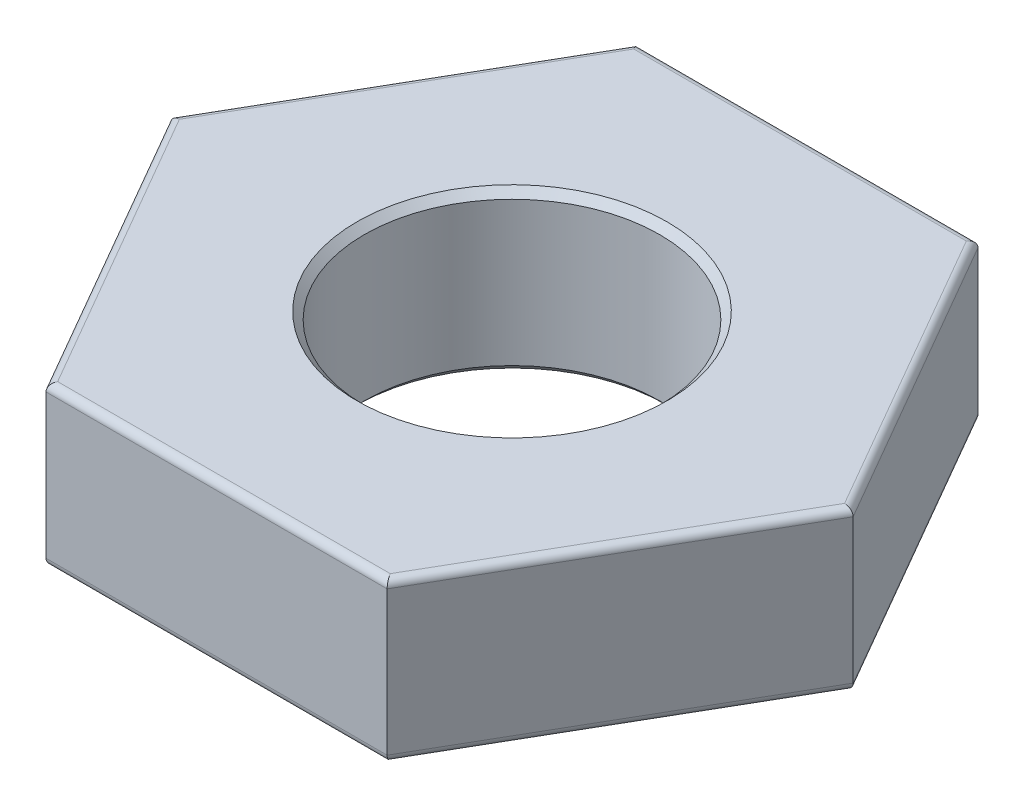
ISO-10303-21;
HEADER;
FILE_DESCRIPTION(('STEP AP214'),'2;1');
FILE_NAME('part.step','',(''),(''),'','','');
FILE_SCHEMA(('AUTOMOTIVE_DESIGN { 1 0 10303 214 1 1 1 1 }'));
ENDSEC;
DATA;
#1=APPLICATION_CONTEXT('core data for automotive mechanical design processes');
#2=APPLICATION_PROTOCOL_DEFINITION('international standard','automotive_design',2000,#1);
#3=PRODUCT_CONTEXT('',#1,'mechanical');
#4=PRODUCT('Part','Part','',(#3));
#5=PRODUCT_RELATED_PRODUCT_CATEGORY('part','',(#4));
#6=PRODUCT_DEFINITION_FORMATION('','',#4);
#7=PRODUCT_DEFINITION_CONTEXT('part definition',#1,'design');
#8=PRODUCT_DEFINITION('design','',#6,#7);
#9=PRODUCT_DEFINITION_SHAPE('','',#8);
#10=(LENGTH_UNIT() NAMED_UNIT(*) SI_UNIT(.MILLI.,.METRE.));
#11=(NAMED_UNIT(*) PLANE_ANGLE_UNIT() SI_UNIT($,.RADIAN.));
#12=(NAMED_UNIT(*) SI_UNIT($,.STERADIAN.) SOLID_ANGLE_UNIT());
#13=UNCERTAINTY_MEASURE_WITH_UNIT(LENGTH_MEASURE(1.E-05),#10,'distance_accuracy_value','');
#14=(GEOMETRIC_REPRESENTATION_CONTEXT(3) GLOBAL_UNCERTAINTY_ASSIGNED_CONTEXT((#13)) GLOBAL_UNIT_ASSIGNED_CONTEXT((#10,
#11,#12)) REPRESENTATION_CONTEXT('',''));
#15=CARTESIAN_POINT('',(0.,0.,0.));
#16=DIRECTION('',(0.,0.,1.));
#17=DIRECTION('',(1.,0.,0.));
#18=AXIS2_PLACEMENT_3D('',#15,#16,#17);
#19=CARTESIAN_POINT('',(0.,2.15,0.));
#20=DIRECTION('',(0.,-1.,0.));
#21=DIRECTION('',(0.,0.,-1.));
#22=AXIS2_PLACEMENT_3D('',#19,#20,#21);
#23=PLANE('',#22);
#24=CARTESIAN_POINT('',(0.,2.15,0.));
#25=DIRECTION('',(0.,-1.,0.));
#26=DIRECTION('',(0.,0.,-1.));
#27=AXIS2_PLACEMENT_3D('',#24,#25,#26);
#28=CIRCLE('',#27,2.10000000000001);
#29=CARTESIAN_POINT('',(0.,2.15,-2.10000000000001));
#30=VERTEX_POINT('',#29);
#31=EDGE_CURVE('E72',#30,#30,#28,.T.);
#32=ORIENTED_EDGE('',*,*,#31,.T.);
#33=EDGE_LOOP('',(#32));
#34=FACE_BOUND('',#33,.T.);
#35=DIRECTION('',(-1.,0.,0.));
#36=VECTOR('',#35,1.);
#37=CARTESIAN_POINT('',(2.3094010767585,2.15,3.9));
#38=LINE('',#37,#36);
#39=CARTESIAN_POINT('',(-2.25166604983954,2.15,3.9));
#40=VERTEX_POINT('',#39);
#41=CARTESIAN_POINT('',(2.25166604983954,2.15,3.9));
#42=VERTEX_POINT('',#41);
#43=EDGE_CURVE('E241',#40,#42,#38,.F.);
#44=ORIENTED_EDGE('',*,*,#43,.T.);
#45=DIRECTION('',(-0.5,0.,0.866025403784439));
#46=VECTOR('',#45,1.);
#47=CARTESIAN_POINT('',(4.53219961313856,2.15,-0.0499999999999984));
#48=LINE('',#47,#46);
#49=CARTESIAN_POINT('',(4.50333209967908,2.15,0.));
#50=VERTEX_POINT('',#49);
#51=EDGE_CURVE('E255',#42,#50,#48,.F.);
#52=ORIENTED_EDGE('',*,*,#51,.T.);
#53=DIRECTION('',(0.499999999999999,0.,0.866025403784439));
#54=VECTOR('',#53,1.);
#55=CARTESIAN_POINT('',(2.22279853638006,2.15,-3.95));
#56=LINE('',#55,#54);
#57=CARTESIAN_POINT('',(2.25166604983954,2.15,-3.9));
#58=VERTEX_POINT('',#57);
#59=EDGE_CURVE('E86',#50,#58,#56,.F.);
#60=ORIENTED_EDGE('',*,*,#59,.T.);
#61=DIRECTION('',(1.,0.,0.));
#62=VECTOR('',#61,1.);
#63=CARTESIAN_POINT('',(-2.3094010767585,2.15,-3.9));
#64=LINE('',#63,#62);
#65=CARTESIAN_POINT('',(-2.25166604983954,2.15,-3.9));
#66=VERTEX_POINT('',#65);
#67=EDGE_CURVE('E250',#58,#66,#64,.F.);
#68=ORIENTED_EDGE('',*,*,#67,.T.);
#69=DIRECTION('',(0.5,0.,-0.866025403784439));
#70=VECTOR('',#69,1.);
#71=CARTESIAN_POINT('',(-4.53219961313856,2.15,0.0499999999999999));
#72=LINE('',#71,#70);
#73=CARTESIAN_POINT('',(-4.50333209967908,2.15,0.));
#74=VERTEX_POINT('',#73);
#75=EDGE_CURVE('E247',#66,#74,#72,.F.);
#76=ORIENTED_EDGE('',*,*,#75,.T.);
#77=DIRECTION('',(-0.5,0.,-0.866025403784439));
#78=VECTOR('',#77,1.);
#79=CARTESIAN_POINT('',(-2.22279853638006,2.15,3.95));
#80=LINE('',#79,#78);
#81=EDGE_CURVE('E244',#74,#40,#80,.F.);
#82=ORIENTED_EDGE('',*,*,#81,.T.);
#83=EDGE_LOOP('',(#44,#52,#60,#68,#76,#82));
#84=FACE_BOUND('',#83,.T.);
#85=ADVANCED_FACE('F62',(#34,#84),#23,.F.);
#86=CARTESIAN_POINT('',(0.,0.,0.));
#87=DIRECTION('',(0.,-1.,0.));
#88=DIRECTION('',(0.,0.,-1.));
#89=AXIS2_PLACEMENT_3D('',#86,#87,#88);
#90=PLANE('',#89);
#91=CARTESIAN_POINT('',(0.,0.,0.));
#92=DIRECTION('',(0.,-1.,0.));
#93=DIRECTION('',(0.,0.,-1.));
#94=AXIS2_PLACEMENT_3D('',#91,#92,#93);
#95=CIRCLE('',#94,2.09999999999999);
#96=CARTESIAN_POINT('',(0.,0.,-2.09999999999999));
#97=VERTEX_POINT('',#96);
#98=EDGE_CURVE('E12',#97,#97,#95,.F.);
#99=ORIENTED_EDGE('',*,*,#98,.T.);
#100=EDGE_LOOP('',(#99));
#101=FACE_BOUND('',#100,.T.);
#102=DIRECTION('',(-0.5,0.,0.866025403784439));
#103=VECTOR('',#102,1.);
#104=CARTESIAN_POINT('',(3.37749907475931,0.,1.95));
#105=LINE('',#104,#103);
#106=CARTESIAN_POINT('',(4.50333209967908,0.,0.));
#107=VERTEX_POINT('',#106);
#108=CARTESIAN_POINT('',(2.25166604983954,0.,3.9));
#109=VERTEX_POINT('',#108);
#110=EDGE_CURVE('E159',#107,#109,#105,.T.);
#111=ORIENTED_EDGE('',*,*,#110,.T.);
#112=DIRECTION('',(-1.,0.,0.));
#113=VECTOR('',#112,1.);
#114=CARTESIAN_POINT('',(0.,0.,3.9));
#115=LINE('',#114,#113);
#116=CARTESIAN_POINT('',(-2.25166604983954,0.,3.9));
#117=VERTEX_POINT('',#116);
#118=EDGE_CURVE('E201',#109,#117,#115,.T.);
#119=ORIENTED_EDGE('',*,*,#118,.T.);
#120=DIRECTION('',(-0.5,0.,-0.866025403784439));
#121=VECTOR('',#120,1.);
#122=CARTESIAN_POINT('',(-3.37749907475931,0.,1.95));
#123=LINE('',#122,#121);
#124=CARTESIAN_POINT('',(-4.50333209967908,0.,0.));
#125=VERTEX_POINT('',#124);
#126=EDGE_CURVE('E198',#117,#125,#123,.T.);
#127=ORIENTED_EDGE('',*,*,#126,.T.);
#128=DIRECTION('',(0.5,0.,-0.866025403784439));
#129=VECTOR('',#128,1.);
#130=CARTESIAN_POINT('',(-3.37749907475931,0.,-1.95));
#131=LINE('',#130,#129);
#132=CARTESIAN_POINT('',(-2.25166604983954,0.,-3.9));
#133=VERTEX_POINT('',#132);
#134=EDGE_CURVE('E195',#125,#133,#131,.T.);
#135=ORIENTED_EDGE('',*,*,#134,.T.);
#136=DIRECTION('',(1.,0.,0.));
#137=VECTOR('',#136,1.);
#138=CARTESIAN_POINT('',(0.,0.,-3.9));
#139=LINE('',#138,#137);
#140=CARTESIAN_POINT('',(2.25166604983954,0.,-3.9));
#141=VERTEX_POINT('',#140);
#142=EDGE_CURVE('E162',#133,#141,#139,.T.);
#143=ORIENTED_EDGE('',*,*,#142,.T.);
#144=DIRECTION('',(0.499999999999999,0.,0.866025403784439));
#145=VECTOR('',#144,1.);
#146=CARTESIAN_POINT('',(3.37749907475931,0.,-1.95));
#147=LINE('',#146,#145);
#148=EDGE_CURVE('E154',#141,#107,#147,.T.);
#149=ORIENTED_EDGE('',*,*,#148,.T.);
#150=EDGE_LOOP('',(#111,#119,#127,#135,#143,#149));
#151=FACE_BOUND('',#150,.T.);
#152=ADVANCED_FACE('F156',(#101,#151),#90,.T.);
#153=CARTESIAN_POINT('',(-4.61880215351701,2.15,0.));
#154=DIRECTION('',(-0.866025403784438,0.,-0.5));
#155=DIRECTION('',(-0.5,0.,0.866025403784439));
#156=AXIS2_PLACEMENT_3D('',#153,#154,#155);
#157=PLANE('',#156);
#158=DIRECTION('',(0.,-1.,0.));
#159=VECTOR('',#158,1.);
#160=CARTESIAN_POINT('',(-2.3094010767585,2.15,-4.));
#161=LINE('',#160,#159);
#162=CARTESIAN_POINT('',(-2.3094010767585,2.05,-4.));
#163=VERTEX_POINT('',#162);
#164=CARTESIAN_POINT('',(-2.3094010767585,0.100000000000001,-4.));
#165=VERTEX_POINT('',#164);
#166=EDGE_CURVE('E190',#163,#165,#161,.T.);
#167=ORIENTED_EDGE('',*,*,#166,.T.);
#168=DIRECTION('',(0.5,0.,-0.866025403784439));
#169=VECTOR('',#168,1.);
#170=CARTESIAN_POINT('',(-4.61880215351701,0.0999999999999998,0.));
#171=LINE('',#170,#169);
#172=CARTESIAN_POINT('',(-4.61880215351701,0.100000000000001,0.));
#173=VERTEX_POINT('',#172);
#174=EDGE_CURVE('E220',#165,#173,#171,.F.);
#175=ORIENTED_EDGE('',*,*,#174,.T.);
#176=DIRECTION('',(0.,-1.,0.));
#177=VECTOR('',#176,1.);
#178=CARTESIAN_POINT('',(-4.61880215351701,2.15,0.));
#179=LINE('',#178,#177);
#180=CARTESIAN_POINT('',(-4.61880215351701,2.05,0.));
#181=VERTEX_POINT('',#180);
#182=EDGE_CURVE('E183',#181,#173,#179,.T.);
#183=ORIENTED_EDGE('',*,*,#182,.F.);
#184=DIRECTION('',(0.5,0.,-0.866025403784439));
#185=VECTOR('',#184,1.);
#186=CARTESIAN_POINT('',(-2.3094010767585,2.05,-4.));
#187=LINE('',#186,#185);
#188=EDGE_CURVE('E217',#181,#163,#187,.T.);
#189=ORIENTED_EDGE('',*,*,#188,.T.);
#190=EDGE_LOOP('',(#167,#175,#183,#189));
#191=FACE_BOUND('',#190,.T.);
#192=ADVANCED_FACE('F324',(#191),#157,.T.);
#193=CARTESIAN_POINT('',(-2.3094010767585,2.15,4.));
#194=DIRECTION('',(-0.866025403784438,0.,0.5));
#195=DIRECTION('',(0.5,0.,0.866025403784439));
#196=AXIS2_PLACEMENT_3D('',#193,#194,#195);
#197=PLANE('',#196);
#198=ORIENTED_EDGE('',*,*,#182,.T.);
#199=DIRECTION('',(-0.5,0.,-0.866025403784439));
#200=VECTOR('',#199,1.);
#201=CARTESIAN_POINT('',(-2.3094010767585,0.0999999999999998,4.));
#202=LINE('',#201,#200);
#203=CARTESIAN_POINT('',(-2.3094010767585,0.100000000000001,4.));
#204=VERTEX_POINT('',#203);
#205=EDGE_CURVE('E214',#173,#204,#202,.F.);
#206=ORIENTED_EDGE('',*,*,#205,.T.);
#207=DIRECTION('',(0.,-1.,0.));
#208=VECTOR('',#207,1.);
#209=CARTESIAN_POINT('',(-2.3094010767585,2.15,4.));
#210=LINE('',#209,#208);
#211=CARTESIAN_POINT('',(-2.3094010767585,2.05,4.));
#212=VERTEX_POINT('',#211);
#213=EDGE_CURVE('E187',#212,#204,#210,.T.);
#214=ORIENTED_EDGE('',*,*,#213,.F.);
#215=DIRECTION('',(-0.5,0.,-0.866025403784439));
#216=VECTOR('',#215,1.);
#217=CARTESIAN_POINT('',(-4.61880215351701,2.05,0.));
#218=LINE('',#217,#216);
#219=EDGE_CURVE('E211',#212,#181,#218,.T.);
#220=ORIENTED_EDGE('',*,*,#219,.T.);
#221=EDGE_LOOP('',(#198,#206,#214,#220));
#222=FACE_BOUND('',#221,.T.);
#223=ADVANCED_FACE('F330',(#222),#197,.T.);
#224=CARTESIAN_POINT('',(2.3094010767585,2.15,4.));
#225=DIRECTION('',(0.,0.,1.));
#226=DIRECTION('',(1.,0.,0.));
#227=AXIS2_PLACEMENT_3D('',#224,#225,#226);
#228=PLANE('',#227);
#229=ORIENTED_EDGE('',*,*,#213,.T.);
#230=DIRECTION('',(-1.,0.,0.));
#231=VECTOR('',#230,1.);
#232=CARTESIAN_POINT('',(2.3094010767585,0.0999999999999998,4.));
#233=LINE('',#232,#231);
#234=CARTESIAN_POINT('',(2.3094010767585,0.100000000000001,4.));
#235=VERTEX_POINT('',#234);
#236=EDGE_CURVE('E207',#204,#235,#233,.F.);
#237=ORIENTED_EDGE('',*,*,#236,.T.);
#238=DIRECTION('',(0.,-1.,0.));
#239=VECTOR('',#238,1.);
#240=CARTESIAN_POINT('',(2.3094010767585,2.15,4.));
#241=LINE('',#240,#239);
#242=CARTESIAN_POINT('',(2.3094010767585,2.05,4.));
#243=VERTEX_POINT('',#242);
#244=EDGE_CURVE('E420',#243,#235,#241,.T.);
#245=ORIENTED_EDGE('',*,*,#244,.F.);
#246=DIRECTION('',(-1.,0.,0.));
#247=VECTOR('',#246,1.);
#248=CARTESIAN_POINT('',(-2.3094010767585,2.05,4.));
#249=LINE('',#248,#247);
#250=EDGE_CURVE('E204',#243,#212,#249,.T.);
#251=ORIENTED_EDGE('',*,*,#250,.T.);
#252=EDGE_LOOP('',(#229,#237,#245,#251));
#253=FACE_BOUND('',#252,.T.);
#254=ADVANCED_FACE('F337',(#253),#228,.T.);
#255=CARTESIAN_POINT('',(4.61880215351701,2.15,0.));
#256=DIRECTION('',(0.866025403784439,0.,0.5));
#257=DIRECTION('',(0.5,0.,-0.866025403784439));
#258=AXIS2_PLACEMENT_3D('',#255,#256,#257);
#259=PLANE('',#258);
#260=ORIENTED_EDGE('',*,*,#244,.T.);
#261=DIRECTION('',(-0.5,0.,0.866025403784439));
#262=VECTOR('',#261,1.);
#263=CARTESIAN_POINT('',(4.61880215351701,0.0999999999999998,0.));
#264=LINE('',#263,#262);
#265=CARTESIAN_POINT('',(4.61880215351701,0.100000000000001,0.));
#266=VERTEX_POINT('',#265);
#267=EDGE_CURVE('E238',#235,#266,#264,.F.);
#268=ORIENTED_EDGE('',*,*,#267,.T.);
#269=DIRECTION('',(0.,-1.,0.));
#270=VECTOR('',#269,1.);
#271=CARTESIAN_POINT('',(4.61880215351701,2.15,0.));
#272=LINE('',#271,#270);
#273=CARTESIAN_POINT('',(4.61880215351701,2.05,0.));
#274=VERTEX_POINT('',#273);
#275=EDGE_CURVE('E414',#274,#266,#272,.T.);
#276=ORIENTED_EDGE('',*,*,#275,.F.);
#277=DIRECTION('',(-0.5,0.,0.866025403784439));
#278=VECTOR('',#277,1.);
#279=CARTESIAN_POINT('',(2.3094010767585,2.05,4.));
#280=LINE('',#279,#278);
#281=EDGE_CURVE('E234',#274,#243,#280,.T.);
#282=ORIENTED_EDGE('',*,*,#281,.T.);
#283=EDGE_LOOP('',(#260,#268,#276,#282));
#284=FACE_BOUND('',#283,.T.);
#285=ADVANCED_FACE('F341',(#284),#259,.T.);
#286=CARTESIAN_POINT('',(2.3094010767585,2.15,-4.));
#287=DIRECTION('',(0.866025403784439,0.,-0.499999999999999));
#288=DIRECTION('',(-0.499999999999999,0.,-0.866025403784439));
#289=AXIS2_PLACEMENT_3D('',#286,#287,#288);
#290=PLANE('',#289);
#291=ORIENTED_EDGE('',*,*,#275,.T.);
#292=DIRECTION('',(0.499999999999999,0.,0.866025403784439));
#293=VECTOR('',#292,1.);
#294=CARTESIAN_POINT('',(2.3094010767585,0.0999999999999998,-4.));
#295=LINE('',#294,#293);
#296=CARTESIAN_POINT('',(2.3094010767585,0.100000000000001,-4.));
#297=VERTEX_POINT('',#296);
#298=EDGE_CURVE('E172',#266,#297,#295,.F.);
#299=ORIENTED_EDGE('',*,*,#298,.T.);
#300=DIRECTION('',(0.,-1.,0.));
#301=VECTOR('',#300,1.);
#302=CARTESIAN_POINT('',(2.3094010767585,2.15,-4.));
#303=LINE('',#302,#301);
#304=CARTESIAN_POINT('',(2.3094010767585,2.05,-4.));
#305=VERTEX_POINT('',#304);
#306=EDGE_CURVE('E416',#305,#297,#303,.T.);
#307=ORIENTED_EDGE('',*,*,#306,.F.);
#308=DIRECTION('',(0.499999999999999,0.,0.866025403784439));
#309=VECTOR('',#308,1.);
#310=CARTESIAN_POINT('',(4.61880215351701,2.05,0.));
#311=LINE('',#310,#309);
#312=EDGE_CURVE('E229',#305,#274,#311,.T.);
#313=ORIENTED_EDGE('',*,*,#312,.T.);
#314=EDGE_LOOP('',(#291,#299,#307,#313));
#315=FACE_BOUND('',#314,.T.);
#316=ADVANCED_FACE('F345',(#315),#290,.T.);
#317=CARTESIAN_POINT('',(-2.3094010767585,2.15,-4.));
#318=DIRECTION('',(0.,0.,-1.));
#319=DIRECTION('',(-1.,0.,0.));
#320=AXIS2_PLACEMENT_3D('',#317,#318,#319);
#321=PLANE('',#320);
#322=ORIENTED_EDGE('',*,*,#306,.T.);
#323=DIRECTION('',(1.,0.,0.));
#324=VECTOR('',#323,1.);
#325=CARTESIAN_POINT('',(-2.3094010767585,0.0999999999999998,-4.));
#326=LINE('',#325,#324);
#327=EDGE_CURVE('E226',#297,#165,#326,.F.);
#328=ORIENTED_EDGE('',*,*,#327,.T.);
#329=ORIENTED_EDGE('',*,*,#166,.F.);
#330=DIRECTION('',(1.,0.,0.));
#331=VECTOR('',#330,1.);
#332=CARTESIAN_POINT('',(2.3094010767585,2.05,-4.));
#333=LINE('',#332,#331);
#334=EDGE_CURVE('E223',#163,#305,#333,.T.);
#335=ORIENTED_EDGE('',*,*,#334,.T.);
#336=EDGE_LOOP('',(#322,#328,#329,#335));
#337=FACE_BOUND('',#336,.T.);
#338=ADVANCED_FACE('F315',(#337),#321,.T.);
#339=CARTESIAN_POINT('',(0.,2.15,0.));
#340=DIRECTION('',(0.,-1.,0.));
#341=DIRECTION('',(0.,0.,-1.));
#342=AXIS2_PLACEMENT_3D('',#339,#340,#341);
#343=CYLINDRICAL_SURFACE('',#342,2.);
#344=CARTESIAN_POINT('',(0.,2.05,0.));
#345=DIRECTION('',(0.,-1.,0.));
#346=DIRECTION('',(0.,0.,-1.));
#347=AXIS2_PLACEMENT_3D('',#344,#345,#346);
#348=CIRCLE('',#347,2.);
#349=CARTESIAN_POINT('',(0.,2.05,-2.));
#350=VERTEX_POINT('',#349);
#351=EDGE_CURVE('E297',#350,#350,#348,.F.);
#352=CARTESIAN_POINT('',(0.,0.0999999999999938,0.));
#353=DIRECTION('',(0.,-1.,0.));
#354=DIRECTION('',(0.,0.,-1.));
#355=AXIS2_PLACEMENT_3D('',#352,#353,#354);
#356=CIRCLE('',#355,2.);
#357=CARTESIAN_POINT('',(0.,0.0999999999999938,-2.));
#358=VERTEX_POINT('',#357);
#359=EDGE_CURVE('E258',#358,#358,#356,.T.);
#360=CARTESIAN_POINT('',(0.,2.05,-2.));
#361=CARTESIAN_POINT('',(0.,2.0296875,-2.));
#362=CARTESIAN_POINT('',(0.,2.009375,-2.));
#363=CARTESIAN_POINT('',(0.,1.96875,-2.));
#364=CARTESIAN_POINT('',(0.,1.9484375,-2.));
#365=CARTESIAN_POINT('',(0.,1.9078125,-2.));
#366=CARTESIAN_POINT('',(0.,1.8875,-2.));
#367=CARTESIAN_POINT('',(0.,1.846875,-2.));
#368=CARTESIAN_POINT('',(0.,1.8265625,-2.));
#369=CARTESIAN_POINT('',(0.,1.7859375,-2.));
#370=CARTESIAN_POINT('',(0.,1.765625,-2.));
#371=CARTESIAN_POINT('',(0.,1.725,-2.));
#372=CARTESIAN_POINT('',(0.,1.7046875,-2.));
#373=CARTESIAN_POINT('',(0.,1.6640625,-2.));
#374=CARTESIAN_POINT('',(0.,1.64375,-2.));
#375=CARTESIAN_POINT('',(0.,1.603125,-2.));
#376=CARTESIAN_POINT('',(0.,1.5828125,-2.));
#377=CARTESIAN_POINT('',(0.,1.5421875,-2.));
#378=CARTESIAN_POINT('',(0.,1.521875,-2.));
#379=CARTESIAN_POINT('',(0.,1.48124999999999,-2.));
#380=CARTESIAN_POINT('',(0.,1.4609375,-2.));
#381=CARTESIAN_POINT('',(0.,1.42031249999999,-2.));
#382=CARTESIAN_POINT('',(0.,1.4,-2.));
#383=CARTESIAN_POINT('',(0.,1.35937499999999,-2.));
#384=CARTESIAN_POINT('',(0.,1.33906249999999,-2.));
#385=CARTESIAN_POINT('',(0.,1.29843749999999,-2.));
#386=CARTESIAN_POINT('',(0.,1.27812499999999,-2.));
#387=CARTESIAN_POINT('',(0.,1.23749999999999,-2.));
#388=CARTESIAN_POINT('',(0.,1.21718749999999,-2.));
#389=CARTESIAN_POINT('',(0.,1.17656249999999,-2.));
#390=CARTESIAN_POINT('',(0.,1.15624999999999,-2.));
#391=CARTESIAN_POINT('',(0.,1.11562499999999,-2.));
#392=CARTESIAN_POINT('',(0.,1.09531249999999,-2.));
#393=CARTESIAN_POINT('',(0.,1.05468749999999,-2.));
#394=CARTESIAN_POINT('',(0.,1.03437499999999,-2.));
#395=CARTESIAN_POINT('',(0.,0.993749999999995,-2.));
#396=CARTESIAN_POINT('',(0.,0.973437499999995,-2.));
#397=CARTESIAN_POINT('',(0.,0.932812499999994,-2.));
#398=CARTESIAN_POINT('',(0.,0.912499999999995,-2.));
#399=CARTESIAN_POINT('',(0.,0.871874999999995,-2.));
#400=CARTESIAN_POINT('',(0.,0.851562499999994,-2.));
#401=CARTESIAN_POINT('',(0.,0.810937499999994,-2.));
#402=CARTESIAN_POINT('',(0.,0.790624999999994,-2.));
#403=CARTESIAN_POINT('',(0.,0.749999999999994,-2.));
#404=CARTESIAN_POINT('',(0.,0.729687499999994,-2.));
#405=CARTESIAN_POINT('',(0.,0.689062499999994,-2.));
#406=CARTESIAN_POINT('',(0.,0.668749999999994,-2.));
#407=CARTESIAN_POINT('',(0.,0.628124999999994,-2.));
#408=CARTESIAN_POINT('',(0.,0.607812499999994,-2.));
#409=CARTESIAN_POINT('',(0.,0.567187499999994,-2.));
#410=CARTESIAN_POINT('',(0.,0.546874999999994,-2.));
#411=CARTESIAN_POINT('',(0.,0.506249999999994,-2.));
#412=CARTESIAN_POINT('',(0.,0.485937499999994,-2.));
#413=CARTESIAN_POINT('',(0.,0.445312499999994,-2.));
#414=CARTESIAN_POINT('',(0.,0.424999999999994,-2.));
#415=CARTESIAN_POINT('',(0.,0.384374999999994,-2.));
#416=CARTESIAN_POINT('',(0.,0.364062499999994,-2.));
#417=CARTESIAN_POINT('',(0.,0.323437499999994,-2.));
#418=CARTESIAN_POINT('',(0.,0.303124999999994,-2.));
#419=CARTESIAN_POINT('',(0.,0.262499999999994,-2.));
#420=CARTESIAN_POINT('',(0.,0.242187499999994,-2.));
#421=CARTESIAN_POINT('',(0.,0.201562499999994,-2.));
#422=CARTESIAN_POINT('',(0.,0.181249999999994,-2.));
#423=CARTESIAN_POINT('',(0.,0.140624999999994,-2.));
#424=CARTESIAN_POINT('',(0.,0.120312499999994,-2.));
#425=CARTESIAN_POINT('',(0.,0.0999999999999938,-2.));
#426=B_SPLINE_CURVE_WITH_KNOTS('',3,(#360,#361,#362,#363,#364,#365,#366,#367,#368,#369,#370,
#371,#372,#373,#374,#375,#376,#377,#378,#379,#380,#381,#382,#383,#384,#385,#386,#387,#388,#389,
#390,#391,#392,#393,#394,#395,#396,#397,#398,#399,#400,#401,#402,#403,#404,#405,#406,#407,#408,
#409,#410,#411,#412,#413,#414,#415,#416,#417,#418,#419,#420,#421,#422,#423,#424,#425),
.UNSPECIFIED.,.F.,.F.,(4,2,2,2,2,2,2,2,2,2,2,2,2,2,2,2,2,2,2,2,2,2,2,2,2,2,2,2,2,2,2,2,4),(0.,
0.0609375000000002,0.121875,0.1828125,0.24375,0.3046875,0.365625,0.426562500000001,
0.487500000000001,0.548437500000001,0.609375000000001,0.670312500000001,0.731250000000001,
0.792187500000001,0.853125000000001,0.914062500000001,0.975000000000001,1.0359375,1.096875,
1.1578125,1.21875,1.2796875,1.340625,1.4015625,1.4625,1.5234375,1.584375,1.6453125,1.70625,
1.7671875,1.828125,1.8890625,1.95),.UNSPECIFIED.);
#427=EDGE_CURVE('BSEAM311',#350,#358,#426,.T.);
#428=ORIENTED_EDGE('',*,*,#351,.T.);
#429=ORIENTED_EDGE('',*,*,#359,.T.);
#430=ORIENTED_EDGE('',*,*,#427,.T.);
#431=ORIENTED_EDGE('',*,*,#427,.F.);
#432=EDGE_LOOP('',(#428,#430,#429,#431));
#433=FACE_BOUND('',#432,.T.);
#434=ADVANCED_FACE('F311',(#433),#343,.F.);
#435=CARTESIAN_POINT('',(0.,0.1,-3.9));
#436=DIRECTION('',(1.,0.,0.));
#437=DIRECTION('',(0.,0.,-1.));
#438=AXIS2_PLACEMENT_3D('',#435,#436,#437);
#439=CYLINDRICAL_SURFACE('',#438,0.1);
#440=CARTESIAN_POINT('',(-2.25166604983954,0.1,-3.9));
#441=DIRECTION('',(0.866025403784439,0.,-0.5));
#442=DIRECTION('',(0.5,0.,0.866025403784439));
#443=AXIS2_PLACEMENT_3D('',#440,#441,#442);
#444=ELLIPSE('',#443,0.115470053837925,0.1);
#445=EDGE_CURVE('E176',#165,#133,#444,.F.);
#446=ORIENTED_EDGE('',*,*,#445,.F.);
#447=ORIENTED_EDGE('',*,*,#327,.F.);
#448=CARTESIAN_POINT('',(2.25166604983954,0.1,-3.9));
#449=DIRECTION('',(0.866025403784438,0.,0.5));
#450=DIRECTION('',(-0.5,0.,0.866025403784439));
#451=AXIS2_PLACEMENT_3D('',#448,#449,#450);
#452=ELLIPSE('',#451,0.115470053837925,0.1);
#453=EDGE_CURVE('E271',#141,#297,#452,.T.);
#454=ORIENTED_EDGE('',*,*,#453,.F.);
#455=ORIENTED_EDGE('',*,*,#142,.F.);
#456=EDGE_LOOP('',(#446,#447,#454,#455));
#457=FACE_BOUND('',#456,.T.);
#458=ADVANCED_FACE('F314',(#457),#439,.T.);
#459=CARTESIAN_POINT('',(3.37749907475931,0.1,-1.95));
#460=DIRECTION('',(0.499999999999999,0.,0.866025403784439));
#461=DIRECTION('',(0.866025403784439,0.,-0.499999999999999));
#462=AXIS2_PLACEMENT_3D('',#459,#460,#461);
#463=CYLINDRICAL_SURFACE('',#462,0.1);
#464=ORIENTED_EDGE('',*,*,#453,.T.);
#465=ORIENTED_EDGE('',*,*,#298,.F.);
#466=CARTESIAN_POINT('',(4.50333209967908,0.1,0.));
#467=DIRECTION('',(0.,0.,1.));
#468=DIRECTION('',(-1.,0.,0.));
#469=AXIS2_PLACEMENT_3D('',#466,#467,#468);
#470=ELLIPSE('',#469,0.115470053837925,0.1);
#471=EDGE_CURVE('E170',#107,#266,#470,.T.);
#472=ORIENTED_EDGE('',*,*,#471,.F.);
#473=ORIENTED_EDGE('',*,*,#148,.F.);
#474=EDGE_LOOP('',(#464,#465,#472,#473));
#475=FACE_BOUND('',#474,.T.);
#476=ADVANCED_FACE('F171',(#475),#463,.T.);
#477=CARTESIAN_POINT('',(-3.37749907475931,0.1,-1.95));
#478=DIRECTION('',(0.5,0.,-0.866025403784439));
#479=DIRECTION('',(-0.866025403784439,0.,-0.5));
#480=AXIS2_PLACEMENT_3D('',#477,#478,#479);
#481=CYLINDRICAL_SURFACE('',#480,0.1);
#482=ORIENTED_EDGE('',*,*,#445,.T.);
#483=ORIENTED_EDGE('',*,*,#134,.F.);
#484=CARTESIAN_POINT('',(-4.50333209967908,0.1,0.));
#485=DIRECTION('',(0.,0.,-1.));
#486=DIRECTION('',(1.,0.,0.));
#487=AXIS2_PLACEMENT_3D('',#484,#485,#486);
#488=ELLIPSE('',#487,0.115470053837925,0.1);
#489=EDGE_CURVE('E177',#173,#125,#488,.F.);
#490=ORIENTED_EDGE('',*,*,#489,.F.);
#491=ORIENTED_EDGE('',*,*,#174,.F.);
#492=EDGE_LOOP('',(#482,#483,#490,#491));
#493=FACE_BOUND('',#492,.T.);
#494=ADVANCED_FACE('F364',(#493),#481,.T.);
#495=CARTESIAN_POINT('',(3.37749907475931,0.1,1.95));
#496=DIRECTION('',(-0.5,0.,0.866025403784439));
#497=DIRECTION('',(0.866025403784439,0.,0.5));
#498=AXIS2_PLACEMENT_3D('',#495,#496,#497);
#499=CYLINDRICAL_SURFACE('',#498,0.1);
#500=ORIENTED_EDGE('',*,*,#471,.T.);
#501=ORIENTED_EDGE('',*,*,#267,.F.);
#502=CARTESIAN_POINT('',(2.25166604983954,0.1,3.9));
#503=DIRECTION('',(-0.866025403784439,0.,0.5));
#504=DIRECTION('',(0.5,0.,0.866025403784439));
#505=AXIS2_PLACEMENT_3D('',#502,#503,#504);
#506=ELLIPSE('',#505,0.115470053837925,0.1);
#507=EDGE_CURVE('E180',#109,#235,#506,.T.);
#508=ORIENTED_EDGE('',*,*,#507,.F.);
#509=ORIENTED_EDGE('',*,*,#110,.F.);
#510=EDGE_LOOP('',(#500,#501,#508,#509));
#511=FACE_BOUND('',#510,.T.);
#512=ADVANCED_FACE('F179',(#511),#499,.T.);
#513=CARTESIAN_POINT('',(-3.37749907475931,0.1,1.95));
#514=DIRECTION('',(-0.5,0.,-0.866025403784439));
#515=DIRECTION('',(-0.866025403784438,0.,0.5));
#516=AXIS2_PLACEMENT_3D('',#513,#514,#515);
#517=CYLINDRICAL_SURFACE('',#516,0.1);
#518=ORIENTED_EDGE('',*,*,#489,.T.);
#519=ORIENTED_EDGE('',*,*,#126,.F.);
#520=CARTESIAN_POINT('',(-2.25166604983954,0.1,3.9));
#521=DIRECTION('',(-0.866025403784439,0.,-0.5));
#522=DIRECTION('',(0.5,0.,-0.866025403784439));
#523=AXIS2_PLACEMENT_3D('',#520,#521,#522);
#524=ELLIPSE('',#523,0.115470053837925,0.1);
#525=EDGE_CURVE('E259',#204,#117,#524,.F.);
#526=ORIENTED_EDGE('',*,*,#525,.F.);
#527=ORIENTED_EDGE('',*,*,#205,.F.);
#528=EDGE_LOOP('',(#518,#519,#526,#527));
#529=FACE_BOUND('',#528,.T.);
#530=ADVANCED_FACE('F357',(#529),#517,.T.);
#531=CARTESIAN_POINT('',(0.,0.1,3.9));
#532=DIRECTION('',(-1.,0.,0.));
#533=DIRECTION('',(0.,0.,1.));
#534=AXIS2_PLACEMENT_3D('',#531,#532,#533);
#535=CYLINDRICAL_SURFACE('',#534,0.1);
#536=ORIENTED_EDGE('',*,*,#507,.T.);
#537=ORIENTED_EDGE('',*,*,#236,.F.);
#538=ORIENTED_EDGE('',*,*,#525,.T.);
#539=ORIENTED_EDGE('',*,*,#118,.F.);
#540=EDGE_LOOP('',(#536,#537,#538,#539));
#541=FACE_BOUND('',#540,.T.);
#542=ADVANCED_FACE('F353',(#541),#535,.T.);
#543=CARTESIAN_POINT('',(-4.53219961313856,2.05,0.0499999999999998));
#544=DIRECTION('',(-0.5,0.,0.866025403784439));
#545=DIRECTION('',(0.866025403784439,0.,0.5));
#546=AXIS2_PLACEMENT_3D('',#543,#544,#545);
#547=CYLINDRICAL_SURFACE('',#546,0.1);
#548=CARTESIAN_POINT('',(-4.50333209967908,2.05,0.));
#549=DIRECTION('',(0.,0.,1.));
#550=DIRECTION('',(1.,0.,0.));
#551=AXIS2_PLACEMENT_3D('',#548,#549,#550);
#552=ELLIPSE('',#551,0.115470053837925,0.1);
#553=EDGE_CURVE('E287',#74,#181,#552,.T.);
#554=ORIENTED_EDGE('',*,*,#553,.F.);
#555=ORIENTED_EDGE('',*,*,#75,.F.);
#556=CARTESIAN_POINT('',(-2.25166604983954,2.05,-3.9));
#557=DIRECTION('',(-0.866025403784439,0.,0.5));
#558=DIRECTION('',(0.5,0.,0.866025403784439));
#559=AXIS2_PLACEMENT_3D('',#556,#557,#558);
#560=ELLIPSE('',#559,0.115470053837925,0.1);
#561=EDGE_CURVE('E262',#163,#66,#560,.F.);
#562=ORIENTED_EDGE('',*,*,#561,.F.);
#563=ORIENTED_EDGE('',*,*,#188,.F.);
#564=EDGE_LOOP('',(#554,#555,#562,#563));
#565=FACE_BOUND('',#564,.T.);
#566=ADVANCED_FACE('F356',(#565),#547,.T.);
#567=CARTESIAN_POINT('',(-2.3094010767585,2.05,-3.9));
#568=DIRECTION('',(-1.,0.,0.));
#569=DIRECTION('',(0.,0.,1.));
#570=AXIS2_PLACEMENT_3D('',#567,#568,#569);
#571=CYLINDRICAL_SURFACE('',#570,0.1);
#572=ORIENTED_EDGE('',*,*,#561,.T.);
#573=ORIENTED_EDGE('',*,*,#67,.F.);
#574=CARTESIAN_POINT('',(2.25166604983954,2.05,-3.9));
#575=DIRECTION('',(-0.866025403784438,0.,-0.5));
#576=DIRECTION('',(-0.5,0.,0.866025403784439));
#577=AXIS2_PLACEMENT_3D('',#574,#575,#576);
#578=ELLIPSE('',#577,0.115470053837925,0.1);
#579=EDGE_CURVE('E283',#305,#58,#578,.F.);
#580=ORIENTED_EDGE('',*,*,#579,.F.);
#581=ORIENTED_EDGE('',*,*,#334,.F.);
#582=EDGE_LOOP('',(#572,#573,#580,#581));
#583=FACE_BOUND('',#582,.T.);
#584=ADVANCED_FACE('F386',(#583),#571,.T.);
#585=CARTESIAN_POINT('',(-2.22279853638006,2.05,3.95));
#586=DIRECTION('',(0.5,0.,0.866025403784439));
#587=DIRECTION('',(0.866025403784438,0.,-0.5));
#588=AXIS2_PLACEMENT_3D('',#585,#586,#587);
#589=CYLINDRICAL_SURFACE('',#588,0.1);
#590=ORIENTED_EDGE('',*,*,#553,.T.);
#591=ORIENTED_EDGE('',*,*,#219,.F.);
#592=CARTESIAN_POINT('',(-2.25166604983954,2.05,3.9));
#593=DIRECTION('',(0.866025403784439,0.,0.5));
#594=DIRECTION('',(0.5,0.,-0.866025403784439));
#595=AXIS2_PLACEMENT_3D('',#592,#593,#594);
#596=ELLIPSE('',#595,0.115470053837925,0.1);
#597=EDGE_CURVE('E279',#40,#212,#596,.T.);
#598=ORIENTED_EDGE('',*,*,#597,.F.);
#599=ORIENTED_EDGE('',*,*,#81,.F.);
#600=EDGE_LOOP('',(#590,#591,#598,#599));
#601=FACE_BOUND('',#600,.T.);
#602=ADVANCED_FACE('F382',(#601),#589,.T.);
#603=CARTESIAN_POINT('',(2.22279853638006,2.05,-3.95));
#604=DIRECTION('',(-0.499999999999999,0.,-0.866025403784439));
#605=DIRECTION('',(-0.866025403784439,0.,0.499999999999999));
#606=AXIS2_PLACEMENT_3D('',#603,#604,#605);
#607=CYLINDRICAL_SURFACE('',#606,0.1);
#608=ORIENTED_EDGE('',*,*,#579,.T.);
#609=ORIENTED_EDGE('',*,*,#59,.F.);
#610=CARTESIAN_POINT('',(4.50333209967908,2.05,0.));
#611=DIRECTION('',(0.,0.,-1.));
#612=DIRECTION('',(-1.,0.,0.));
#613=AXIS2_PLACEMENT_3D('',#610,#611,#612);
#614=ELLIPSE('',#613,0.115470053837925,0.1);
#615=EDGE_CURVE('E79',#274,#50,#614,.F.);
#616=ORIENTED_EDGE('',*,*,#615,.F.);
#617=ORIENTED_EDGE('',*,*,#312,.F.);
#618=EDGE_LOOP('',(#608,#609,#616,#617));
#619=FACE_BOUND('',#618,.T.);
#620=ADVANCED_FACE('F378',(#619),#607,.T.);
#621=CARTESIAN_POINT('',(2.3094010767585,2.05,3.9));
#622=DIRECTION('',(1.,0.,0.));
#623=DIRECTION('',(0.,0.,-1.));
#624=AXIS2_PLACEMENT_3D('',#621,#622,#623);
#625=CYLINDRICAL_SURFACE('',#624,0.1);
#626=ORIENTED_EDGE('',*,*,#597,.T.);
#627=ORIENTED_EDGE('',*,*,#250,.F.);
#628=CARTESIAN_POINT('',(2.25166604983954,2.05,3.9));
#629=DIRECTION('',(0.866025403784439,0.,-0.5));
#630=DIRECTION('',(0.5,0.,0.866025403784439));
#631=AXIS2_PLACEMENT_3D('',#628,#629,#630);
#632=ELLIPSE('',#631,0.115470053837925,0.1);
#633=EDGE_CURVE('E274',#42,#243,#632,.T.);
#634=ORIENTED_EDGE('',*,*,#633,.F.);
#635=ORIENTED_EDGE('',*,*,#43,.F.);
#636=EDGE_LOOP('',(#626,#627,#634,#635));
#637=FACE_BOUND('',#636,.T.);
#638=ADVANCED_FACE('F375',(#637),#625,.T.);
#639=CARTESIAN_POINT('',(4.53219961313856,2.05,-0.0499999999999983));
#640=DIRECTION('',(0.5,0.,-0.866025403784439));
#641=DIRECTION('',(-0.866025403784439,0.,-0.5));
#642=AXIS2_PLACEMENT_3D('',#639,#640,#641);
#643=CYLINDRICAL_SURFACE('',#642,0.1);
#644=ORIENTED_EDGE('',*,*,#615,.T.);
#645=ORIENTED_EDGE('',*,*,#51,.F.);
#646=ORIENTED_EDGE('',*,*,#633,.T.);
#647=ORIENTED_EDGE('',*,*,#281,.F.);
#648=EDGE_LOOP('',(#644,#645,#646,#647));
#649=FACE_BOUND('',#648,.T.);
#650=ADVANCED_FACE('F308',(#649),#643,.T.);
#651=CARTESIAN_POINT('',(0.,2.05,0.));
#652=DIRECTION('',(0.,1.,0.));
#653=DIRECTION('',(0.,0.,1.));
#654=AXIS2_PLACEMENT_3D('',#651,#652,#653);
#655=CONICAL_SURFACE('',#654,2.,0.785398163397457);
#656=ORIENTED_EDGE('',*,*,#31,.F.);
#657=EDGE_LOOP('',(#656));
#658=FACE_BOUND('',#657,.T.);
#659=ORIENTED_EDGE('',*,*,#351,.F.);
#660=EDGE_LOOP('',(#659));
#661=FACE_BOUND('',#660,.T.);
#662=ADVANCED_FACE('F305',(#658,#661),#655,.F.);
#663=CARTESIAN_POINT('',(0.,0.,0.));
#664=DIRECTION('',(0.,-1.,0.));
#665=DIRECTION('',(0.,0.,-1.));
#666=AXIS2_PLACEMENT_3D('',#663,#664,#665);
#667=CONICAL_SURFACE('',#666,2.09999999999999,0.785398163397444);
#668=ORIENTED_EDGE('',*,*,#359,.F.);
#669=EDGE_LOOP('',(#668));
#670=FACE_BOUND('',#669,.T.);
#671=ORIENTED_EDGE('',*,*,#98,.F.);
#672=EDGE_LOOP('',(#671));
#673=FACE_BOUND('',#672,.T.);
#674=ADVANCED_FACE('F65',(#670,#673),#667,.F.);
#675=CLOSED_SHELL('',(#85,#152,#192,#223,#254,#285,#316,#338,#434,#458,#476,#494,#512,#530,#542,
#566,#584,#602,#620,#638,#650,#662,#674));
#676=MANIFOLD_SOLID_BREP('B2',#675);
#677=ADVANCED_BREP_SHAPE_REPRESENTATION('',(#18,#676),#14);
#678=SHAPE_DEFINITION_REPRESENTATION(#9,#677);
ENDSEC;
END-ISO-10303-21;
